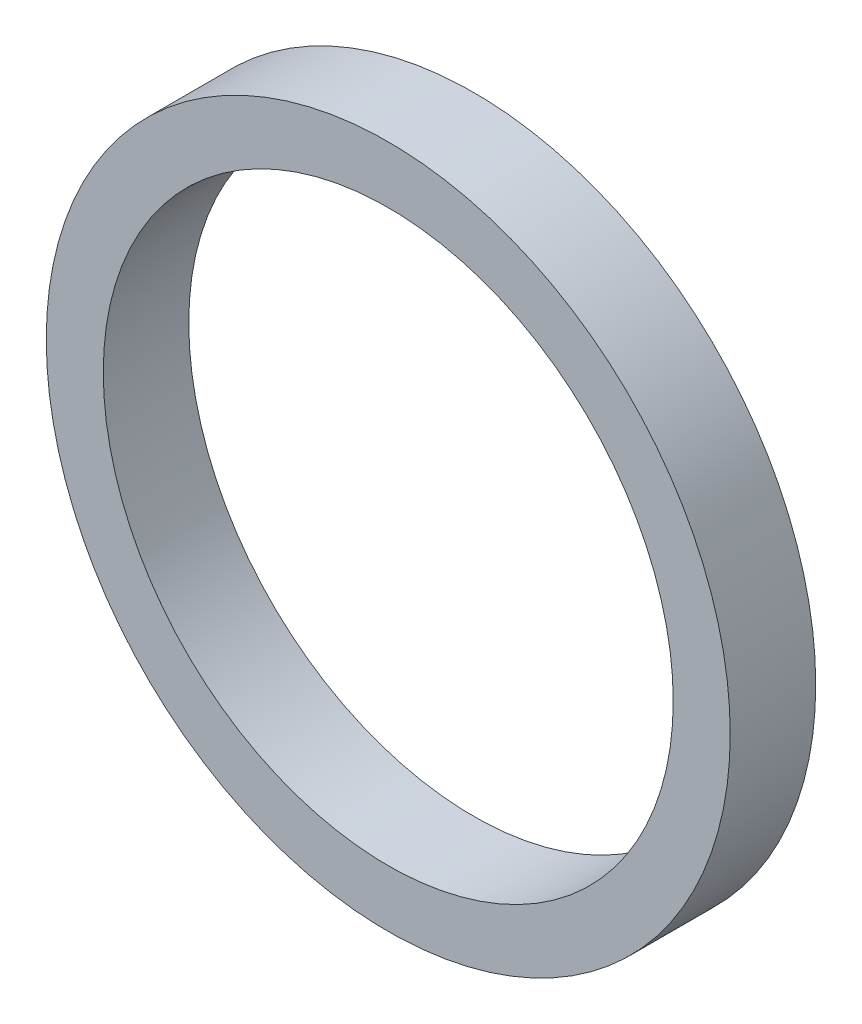
ISO-10303-21;
HEADER;
FILE_DESCRIPTION(('STEP AP214'),'2;1');
FILE_NAME('part.step','',(''),(''),'','','');
FILE_SCHEMA(('AUTOMOTIVE_DESIGN { 1 0 10303 214 1 1 1 1 }'));
ENDSEC;
DATA;
#1=APPLICATION_CONTEXT('core data for automotive mechanical design processes');
#2=APPLICATION_PROTOCOL_DEFINITION('international standard','automotive_design',2000,#1);
#3=PRODUCT_CONTEXT('',#1,'mechanical');
#4=PRODUCT('Part','Part','',(#3));
#5=PRODUCT_RELATED_PRODUCT_CATEGORY('part','',(#4));
#6=PRODUCT_DEFINITION_FORMATION('','',#4);
#7=PRODUCT_DEFINITION_CONTEXT('part definition',#1,'design');
#8=PRODUCT_DEFINITION('design','',#6,#7);
#9=PRODUCT_DEFINITION_SHAPE('','',#8);
#10=(LENGTH_UNIT() NAMED_UNIT(*) SI_UNIT(.MILLI.,.METRE.));
#11=(NAMED_UNIT(*) PLANE_ANGLE_UNIT() SI_UNIT($,.RADIAN.));
#12=(NAMED_UNIT(*) SI_UNIT($,.STERADIAN.) SOLID_ANGLE_UNIT());
#13=UNCERTAINTY_MEASURE_WITH_UNIT(LENGTH_MEASURE(1.E-05),#10,'distance_accuracy_value','');
#14=(GEOMETRIC_REPRESENTATION_CONTEXT(3) GLOBAL_UNCERTAINTY_ASSIGNED_CONTEXT((#13)) GLOBAL_UNIT_ASSIGNED_CONTEXT((#10,
#11,#12)) REPRESENTATION_CONTEXT('',''));
#15=CARTESIAN_POINT('',(0.,0.,0.));
#16=DIRECTION('',(0.,0.,1.));
#17=DIRECTION('',(1.,0.,0.));
#18=AXIS2_PLACEMENT_3D('',#15,#16,#17);
#19=CARTESIAN_POINT('',(0.,0.,60.));
#20=DIRECTION('',(0.,0.,-1.));
#21=DIRECTION('',(-1.,0.,0.));
#22=AXIS2_PLACEMENT_3D('',#19,#20,#21);
#23=CYLINDRICAL_SURFACE('',#22,240.);
#24=CARTESIAN_POINT('',(0.,0.,60.));
#25=DIRECTION('',(0.,0.,1.));
#26=DIRECTION('',(1.,0.,0.));
#27=AXIS2_PLACEMENT_3D('',#24,#25,#26);
#28=CIRCLE('',#27,240.);
#29=CARTESIAN_POINT('',(240.,0.,60.));
#30=VERTEX_POINT('',#29);
#31=EDGE_CURVE('E10',#30,#30,#28,.T.);
#32=ORIENTED_EDGE('',*,*,#31,.F.);
#33=EDGE_LOOP('',(#32));
#34=FACE_BOUND('',#33,.T.);
#35=CARTESIAN_POINT('',(0.,0.,0.));
#36=DIRECTION('',(0.,0.,1.));
#37=DIRECTION('',(1.,0.,0.));
#38=AXIS2_PLACEMENT_3D('',#35,#36,#37);
#39=CIRCLE('',#38,240.);
#40=CARTESIAN_POINT('',(240.,0.,0.));
#41=VERTEX_POINT('',#40);
#42=EDGE_CURVE('E37',#41,#41,#39,.T.);
#43=ORIENTED_EDGE('',*,*,#42,.T.);
#44=EDGE_LOOP('',(#43));
#45=FACE_BOUND('',#44,.T.);
#46=ADVANCED_FACE('F40',(#34,#45),#23,.T.);
#47=CARTESIAN_POINT('',(0.,0.,60.));
#48=DIRECTION('',(0.,0.,1.));
#49=DIRECTION('',(1.,0.,0.));
#50=AXIS2_PLACEMENT_3D('',#47,#48,#49);
#51=PLANE('',#50);
#52=CARTESIAN_POINT('',(0.,0.,60.));
#53=DIRECTION('',(0.,0.,1.));
#54=DIRECTION('',(1.,0.,0.));
#55=AXIS2_PLACEMENT_3D('',#52,#53,#54);
#56=CIRCLE('',#55,200.);
#57=CARTESIAN_POINT('',(200.,0.,60.));
#58=VERTEX_POINT('',#57);
#59=EDGE_CURVE('E47',#58,#58,#56,.T.);
#60=ORIENTED_EDGE('',*,*,#59,.F.);
#61=EDGE_LOOP('',(#60));
#62=FACE_BOUND('',#61,.T.);
#63=ORIENTED_EDGE('',*,*,#31,.T.);
#64=EDGE_LOOP('',(#63));
#65=FACE_BOUND('',#64,.T.);
#66=ADVANCED_FACE('F62',(#62,#65),#51,.T.);
#67=CARTESIAN_POINT('',(0.,0.,0.));
#68=DIRECTION('',(0.,0.,1.));
#69=DIRECTION('',(1.,0.,0.));
#70=AXIS2_PLACEMENT_3D('',#67,#68,#69);
#71=PLANE('',#70);
#72=CARTESIAN_POINT('',(0.,0.,0.));
#73=DIRECTION('',(0.,0.,1.));
#74=DIRECTION('',(1.,0.,0.));
#75=AXIS2_PLACEMENT_3D('',#72,#73,#74);
#76=CIRCLE('',#75,200.);
#77=CARTESIAN_POINT('',(200.,0.,0.));
#78=VERTEX_POINT('',#77);
#79=EDGE_CURVE('E50',#78,#78,#76,.T.);
#80=ORIENTED_EDGE('',*,*,#79,.T.);
#81=EDGE_LOOP('',(#80));
#82=FACE_BOUND('',#81,.T.);
#83=ORIENTED_EDGE('',*,*,#42,.F.);
#84=EDGE_LOOP('',(#83));
#85=FACE_BOUND('',#84,.T.);
#86=ADVANCED_FACE('F54',(#82,#85),#71,.F.);
#87=CARTESIAN_POINT('',(0.,0.,0.));
#88=DIRECTION('',(0.,0.,1.));
#89=DIRECTION('',(1.,0.,0.));
#90=AXIS2_PLACEMENT_3D('',#87,#88,#89);
#91=CYLINDRICAL_SURFACE('',#90,200.);
#92=ORIENTED_EDGE('',*,*,#79,.F.);
#93=EDGE_LOOP('',(#92));
#94=FACE_BOUND('',#93,.T.);
#95=ORIENTED_EDGE('',*,*,#59,.T.);
#96=EDGE_LOOP('',(#95));
#97=FACE_BOUND('',#96,.T.);
#98=ADVANCED_FACE('F59',(#94,#97),#91,.F.);
#99=CLOSED_SHELL('',(#46,#66,#86,#98));
#100=MANIFOLD_SOLID_BREP('B2',#99);
#101=ADVANCED_BREP_SHAPE_REPRESENTATION('',(#18,#100),#14);
#102=SHAPE_DEFINITION_REPRESENTATION(#9,#101);
ENDSEC;
END-ISO-10303-21;
